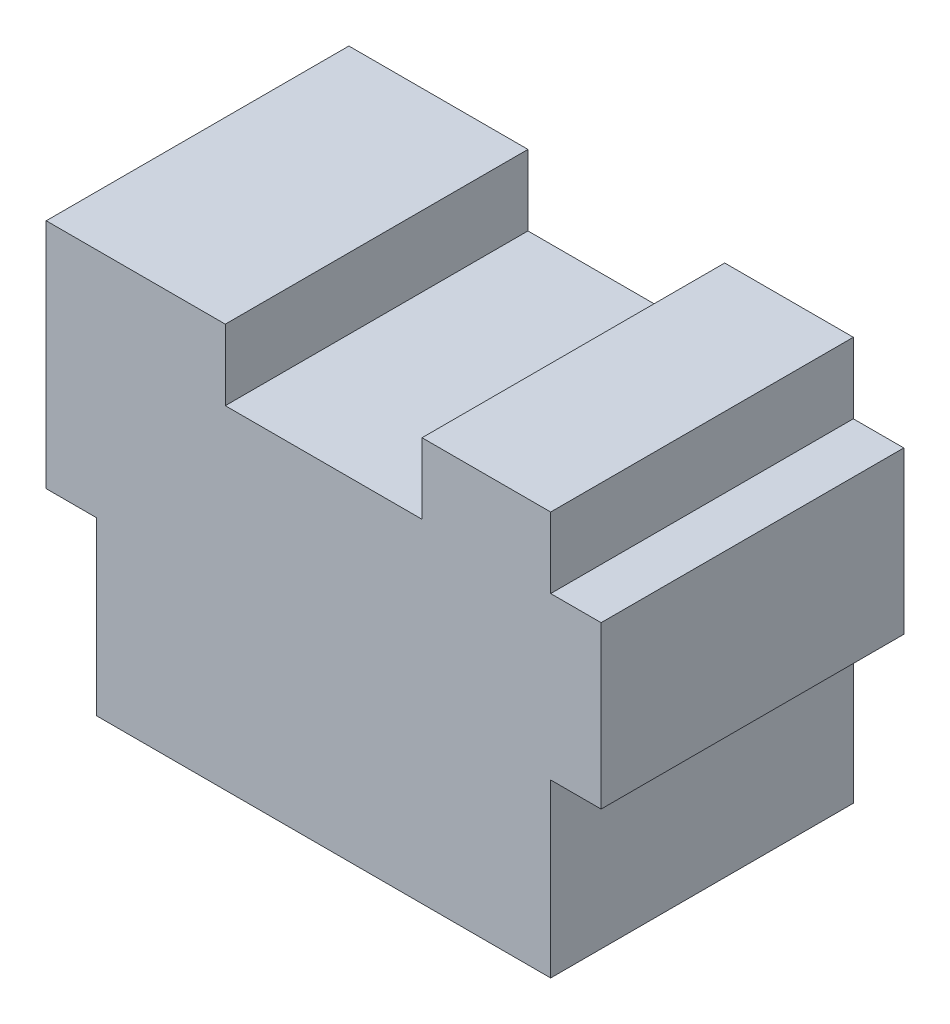
ISO-10303-21;
HEADER;
FILE_DESCRIPTION(('STEP AP214'),'2;1');
FILE_NAME('part.step','',(''),(''),'','','');
FILE_SCHEMA(('AUTOMOTIVE_DESIGN { 1 0 10303 214 1 1 1 1 }'));
ENDSEC;
DATA;
#1=APPLICATION_CONTEXT('core data for automotive mechanical design processes');
#2=APPLICATION_PROTOCOL_DEFINITION('international standard','automotive_design',2000,#1);
#3=PRODUCT_CONTEXT('',#1,'mechanical');
#4=PRODUCT('Part','Part','',(#3));
#5=PRODUCT_RELATED_PRODUCT_CATEGORY('part','',(#4));
#6=PRODUCT_DEFINITION_FORMATION('','',#4);
#7=PRODUCT_DEFINITION_CONTEXT('part definition',#1,'design');
#8=PRODUCT_DEFINITION('design','',#6,#7);
#9=PRODUCT_DEFINITION_SHAPE('','',#8);
#10=(LENGTH_UNIT() NAMED_UNIT(*) SI_UNIT(.MILLI.,.METRE.));
#11=(NAMED_UNIT(*) PLANE_ANGLE_UNIT() SI_UNIT($,.RADIAN.));
#12=(NAMED_UNIT(*) SI_UNIT($,.STERADIAN.) SOLID_ANGLE_UNIT());
#13=UNCERTAINTY_MEASURE_WITH_UNIT(LENGTH_MEASURE(1.E-05),#10,'distance_accuracy_value','');
#14=(GEOMETRIC_REPRESENTATION_CONTEXT(3) GLOBAL_UNCERTAINTY_ASSIGNED_CONTEXT((#13)) GLOBAL_UNIT_ASSIGNED_CONTEXT((#10,
#11,#12)) REPRESENTATION_CONTEXT('',''));
#15=CARTESIAN_POINT('',(0.,0.,0.));
#16=DIRECTION('',(0.,0.,1.));
#17=DIRECTION('',(1.,0.,0.));
#18=AXIS2_PLACEMENT_3D('',#15,#16,#17);
#19=CARTESIAN_POINT('',(-22.5,0.,30.));
#20=DIRECTION('',(-1.,0.,0.));
#21=DIRECTION('',(0.,0.,1.));
#22=AXIS2_PLACEMENT_3D('',#19,#20,#21);
#23=PLANE('',#22);
#24=DIRECTION('',(0.,1.,0.));
#25=VECTOR('',#24,1.);
#26=CARTESIAN_POINT('',(-22.5,0.,0.));
#27=LINE('',#26,#25);
#28=CARTESIAN_POINT('',(-22.5,-20.,0.));
#29=VERTEX_POINT('',#28);
#30=CARTESIAN_POINT('',(-22.5,-3.,0.));
#31=VERTEX_POINT('',#30);
#32=EDGE_CURVE('E177',#29,#31,#27,.T.);
#33=ORIENTED_EDGE('',*,*,#32,.F.);
#34=DIRECTION('',(0.,0.,-1.));
#35=VECTOR('',#34,1.);
#36=CARTESIAN_POINT('',(-22.5,-20.,30.));
#37=LINE('',#36,#35);
#38=CARTESIAN_POINT('',(-22.5,-20.,30.));
#39=VERTEX_POINT('',#38);
#40=EDGE_CURVE('E11',#39,#29,#37,.T.);
#41=ORIENTED_EDGE('',*,*,#40,.F.);
#42=DIRECTION('',(0.,1.,0.));
#43=VECTOR('',#42,1.);
#44=CARTESIAN_POINT('',(-22.5,0.,30.));
#45=LINE('',#44,#43);
#46=CARTESIAN_POINT('',(-22.5,-3.,30.));
#47=VERTEX_POINT('',#46);
#48=EDGE_CURVE('E214',#39,#47,#45,.T.);
#49=ORIENTED_EDGE('',*,*,#48,.T.);
#50=DIRECTION('',(0.,0.,-1.));
#51=VECTOR('',#50,1.);
#52=CARTESIAN_POINT('',(-22.5,-3.,30.));
#53=LINE('',#52,#51);
#54=EDGE_CURVE('E110',#47,#31,#53,.T.);
#55=ORIENTED_EDGE('',*,*,#54,.T.);
#56=EDGE_LOOP('',(#33,#41,#49,#55));
#57=FACE_BOUND('',#56,.T.);
#58=ADVANCED_FACE('F36',(#57),#23,.T.);
#59=CARTESIAN_POINT('',(0.,-20.,30.));
#60=DIRECTION('',(0.,1.,0.));
#61=DIRECTION('',(0.,0.,1.));
#62=AXIS2_PLACEMENT_3D('',#59,#60,#61);
#63=PLANE('',#62);
#64=DIRECTION('',(1.,0.,0.));
#65=VECTOR('',#64,1.);
#66=CARTESIAN_POINT('',(0.,-20.,0.));
#67=LINE('',#66,#65);
#68=CARTESIAN_POINT('',(-9.74999999999999,-20.,0.));
#69=VERTEX_POINT('',#68);
#70=EDGE_CURVE('E182',#29,#69,#67,.T.);
#71=ORIENTED_EDGE('',*,*,#70,.T.);
#72=DIRECTION('',(0.,0.,-1.));
#73=VECTOR('',#72,1.);
#74=CARTESIAN_POINT('',(-9.74999999999999,-20.,26.));
#75=LINE('',#74,#73);
#76=CARTESIAN_POINT('',(-9.74999999999999,-20.,26.));
#77=VERTEX_POINT('',#76);
#78=EDGE_CURVE('E181',#77,#69,#75,.T.);
#79=ORIENTED_EDGE('',*,*,#78,.F.);
#80=DIRECTION('',(1.,0.,0.));
#81=VECTOR('',#80,1.);
#82=CARTESIAN_POINT('',(-37.2636329843952,-20.,26.));
#83=LINE('',#82,#81);
#84=CARTESIAN_POINT('',(9.75,-20.,26.));
#85=VERTEX_POINT('',#84);
#86=EDGE_CURVE('E295',#77,#85,#83,.T.);
#87=ORIENTED_EDGE('',*,*,#86,.T.);
#88=DIRECTION('',(0.,0.,1.));
#89=VECTOR('',#88,1.);
#90=CARTESIAN_POINT('',(9.75,-20.,26.));
#91=LINE('',#90,#89);
#92=CARTESIAN_POINT('',(9.75,-20.,0.));
#93=VERTEX_POINT('',#92);
#94=EDGE_CURVE('E304',#93,#85,#91,.T.);
#95=ORIENTED_EDGE('',*,*,#94,.F.);
#96=CARTESIAN_POINT('',(22.5,-20.,0.));
#97=VERTEX_POINT('',#96);
#98=EDGE_CURVE('E180',#93,#97,#67,.T.);
#99=ORIENTED_EDGE('',*,*,#98,.T.);
#100=DIRECTION('',(0.,0.,-1.));
#101=VECTOR('',#100,1.);
#102=CARTESIAN_POINT('',(22.5,-20.,30.));
#103=LINE('',#102,#101);
#104=CARTESIAN_POINT('',(22.5,-20.,30.));
#105=VERTEX_POINT('',#104);
#106=EDGE_CURVE('E43',#105,#97,#103,.T.);
#107=ORIENTED_EDGE('',*,*,#106,.F.);
#108=DIRECTION('',(1.,0.,0.));
#109=VECTOR('',#108,1.);
#110=CARTESIAN_POINT('',(0.,-20.,30.));
#111=LINE('',#110,#109);
#112=EDGE_CURVE('E263',#39,#105,#111,.T.);
#113=ORIENTED_EDGE('',*,*,#112,.F.);
#114=ORIENTED_EDGE('',*,*,#40,.T.);
#115=EDGE_LOOP('',(#71,#79,#87,#95,#99,#107,#113,#114));
#116=FACE_BOUND('',#115,.T.);
#117=ADVANCED_FACE('F313',(#116),#63,.F.);
#118=CARTESIAN_POINT('',(22.5,0.,30.));
#119=DIRECTION('',(-1.,0.,0.));
#120=DIRECTION('',(0.,0.,1.));
#121=AXIS2_PLACEMENT_3D('',#118,#119,#120);
#122=PLANE('',#121);
#123=DIRECTION('',(0.,1.,0.));
#124=VECTOR('',#123,1.);
#125=CARTESIAN_POINT('',(22.5,0.,0.));
#126=LINE('',#125,#124);
#127=CARTESIAN_POINT('',(22.5,-2.99999999999999,0.));
#128=VERTEX_POINT('',#127);
#129=EDGE_CURVE('E185',#97,#128,#126,.T.);
#130=ORIENTED_EDGE('',*,*,#129,.T.);
#131=DIRECTION('',(0.,0.,-1.));
#132=VECTOR('',#131,1.);
#133=CARTESIAN_POINT('',(22.5,-2.99999999999999,30.));
#134=LINE('',#133,#132);
#135=CARTESIAN_POINT('',(22.5,-2.99999999999999,30.));
#136=VERTEX_POINT('',#135);
#137=EDGE_CURVE('E234',#136,#128,#134,.T.);
#138=ORIENTED_EDGE('',*,*,#137,.F.);
#139=DIRECTION('',(0.,1.,0.));
#140=VECTOR('',#139,1.);
#141=CARTESIAN_POINT('',(22.5,0.,30.));
#142=LINE('',#141,#140);
#143=EDGE_CURVE('E242',#105,#136,#142,.T.);
#144=ORIENTED_EDGE('',*,*,#143,.F.);
#145=ORIENTED_EDGE('',*,*,#106,.T.);
#146=EDGE_LOOP('',(#130,#138,#144,#145));
#147=FACE_BOUND('',#146,.T.);
#148=ADVANCED_FACE('F240',(#147),#122,.F.);
#149=CARTESIAN_POINT('',(0.,-3.,30.));
#150=DIRECTION('',(0.,-1.,0.));
#151=DIRECTION('',(1.,0.,0.));
#152=AXIS2_PLACEMENT_3D('',#149,#150,#151);
#153=PLANE('',#152);
#154=DIRECTION('',(-1.,0.,0.));
#155=VECTOR('',#154,1.);
#156=CARTESIAN_POINT('',(0.,-3.,0.));
#157=LINE('',#156,#155);
#158=CARTESIAN_POINT('',(27.5,-2.99999999999999,0.));
#159=VERTEX_POINT('',#158);
#160=EDGE_CURVE('E188',#159,#128,#157,.T.);
#161=ORIENTED_EDGE('',*,*,#160,.F.);
#162=DIRECTION('',(0.,0.,-1.));
#163=VECTOR('',#162,1.);
#164=CARTESIAN_POINT('',(27.5,-2.99999999999999,30.));
#165=LINE('',#164,#163);
#166=CARTESIAN_POINT('',(27.5,-2.99999999999999,30.));
#167=VERTEX_POINT('',#166);
#168=EDGE_CURVE('E232',#167,#159,#165,.T.);
#169=ORIENTED_EDGE('',*,*,#168,.F.);
#170=DIRECTION('',(-1.,0.,0.));
#171=VECTOR('',#170,1.);
#172=CARTESIAN_POINT('',(0.,-3.,30.));
#173=LINE('',#172,#171);
#174=EDGE_CURVE('E258',#167,#136,#173,.T.);
#175=ORIENTED_EDGE('',*,*,#174,.T.);
#176=ORIENTED_EDGE('',*,*,#137,.T.);
#177=EDGE_LOOP('',(#161,#169,#175,#176));
#178=FACE_BOUND('',#177,.T.);
#179=ADVANCED_FACE('F254',(#178),#153,.T.);
#180=CARTESIAN_POINT('',(27.5,0.,30.));
#181=DIRECTION('',(-1.,0.,0.));
#182=DIRECTION('',(0.,0.,1.));
#183=AXIS2_PLACEMENT_3D('',#180,#181,#182);
#184=PLANE('',#183);
#185=DIRECTION('',(0.,1.,0.));
#186=VECTOR('',#185,1.);
#187=CARTESIAN_POINT('',(27.5,0.,0.));
#188=LINE('',#187,#186);
#189=CARTESIAN_POINT('',(27.5,13.,0.));
#190=VERTEX_POINT('',#189);
#191=EDGE_CURVE('E191',#159,#190,#188,.T.);
#192=ORIENTED_EDGE('',*,*,#191,.T.);
#193=DIRECTION('',(0.,0.,-1.));
#194=VECTOR('',#193,1.);
#195=CARTESIAN_POINT('',(27.5,13.,30.));
#196=LINE('',#195,#194);
#197=CARTESIAN_POINT('',(27.5,13.,30.));
#198=VERTEX_POINT('',#197);
#199=EDGE_CURVE('E229',#198,#190,#196,.T.);
#200=ORIENTED_EDGE('',*,*,#199,.F.);
#201=DIRECTION('',(0.,1.,0.));
#202=VECTOR('',#201,1.);
#203=CARTESIAN_POINT('',(27.5,0.,30.));
#204=LINE('',#203,#202);
#205=EDGE_CURVE('E259',#167,#198,#204,.T.);
#206=ORIENTED_EDGE('',*,*,#205,.F.);
#207=ORIENTED_EDGE('',*,*,#168,.T.);
#208=EDGE_LOOP('',(#192,#200,#206,#207));
#209=FACE_BOUND('',#208,.T.);
#210=ADVANCED_FACE('F345',(#209),#184,.F.);
#211=CARTESIAN_POINT('',(0.,13.,30.));
#212=DIRECTION('',(0.,-1.,0.));
#213=DIRECTION('',(1.,0.,0.));
#214=AXIS2_PLACEMENT_3D('',#211,#212,#213);
#215=PLANE('',#214);
#216=DIRECTION('',(-1.,0.,0.));
#217=VECTOR('',#216,1.);
#218=CARTESIAN_POINT('',(0.,13.,0.));
#219=LINE('',#218,#217);
#220=CARTESIAN_POINT('',(22.5,13.,0.));
#221=VERTEX_POINT('',#220);
#222=EDGE_CURVE('E193',#190,#221,#219,.T.);
#223=ORIENTED_EDGE('',*,*,#222,.T.);
#224=DIRECTION('',(0.,0.,-1.));
#225=VECTOR('',#224,1.);
#226=CARTESIAN_POINT('',(22.5,13.,30.));
#227=LINE('',#226,#225);
#228=CARTESIAN_POINT('',(22.5,13.,30.));
#229=VERTEX_POINT('',#228);
#230=EDGE_CURVE('E227',#229,#221,#227,.T.);
#231=ORIENTED_EDGE('',*,*,#230,.F.);
#232=DIRECTION('',(-1.,0.,0.));
#233=VECTOR('',#232,1.);
#234=CARTESIAN_POINT('',(0.,13.,30.));
#235=LINE('',#234,#233);
#236=EDGE_CURVE('E261',#198,#229,#235,.T.);
#237=ORIENTED_EDGE('',*,*,#236,.F.);
#238=ORIENTED_EDGE('',*,*,#199,.T.);
#239=EDGE_LOOP('',(#223,#231,#237,#238));
#240=FACE_BOUND('',#239,.T.);
#241=ADVANCED_FACE('F348',(#240),#215,.F.);
#242=CARTESIAN_POINT('',(22.5,0.,30.));
#243=DIRECTION('',(1.,0.,0.));
#244=DIRECTION('',(0.,1.,0.));
#245=AXIS2_PLACEMENT_3D('',#242,#243,#244);
#246=PLANE('',#245);
#247=DIRECTION('',(0.,-1.,0.));
#248=VECTOR('',#247,1.);
#249=CARTESIAN_POINT('',(22.5,0.,0.));
#250=LINE('',#249,#248);
#251=CARTESIAN_POINT('',(22.5,20.,0.));
#252=VERTEX_POINT('',#251);
#253=EDGE_CURVE('E196',#252,#221,#250,.T.);
#254=ORIENTED_EDGE('',*,*,#253,.F.);
#255=DIRECTION('',(0.,0.,-1.));
#256=VECTOR('',#255,1.);
#257=CARTESIAN_POINT('',(22.5,20.,30.));
#258=LINE('',#257,#256);
#259=CARTESIAN_POINT('',(22.5,20.,30.));
#260=VERTEX_POINT('',#259);
#261=EDGE_CURVE('E225',#260,#252,#258,.T.);
#262=ORIENTED_EDGE('',*,*,#261,.F.);
#263=DIRECTION('',(0.,-1.,0.));
#264=VECTOR('',#263,1.);
#265=CARTESIAN_POINT('',(22.5,0.,30.));
#266=LINE('',#265,#264);
#267=EDGE_CURVE('E268',#260,#229,#266,.T.);
#268=ORIENTED_EDGE('',*,*,#267,.T.);
#269=ORIENTED_EDGE('',*,*,#230,.T.);
#270=EDGE_LOOP('',(#254,#262,#268,#269));
#271=FACE_BOUND('',#270,.T.);
#272=ADVANCED_FACE('F352',(#271),#246,.T.);
#273=CARTESIAN_POINT('',(0.,20.,30.));
#274=DIRECTION('',(0.,1.,0.));
#275=DIRECTION('',(0.,0.,1.));
#276=AXIS2_PLACEMENT_3D('',#273,#274,#275);
#277=PLANE('',#276);
#278=DIRECTION('',(1.,0.,0.));
#279=VECTOR('',#278,1.);
#280=CARTESIAN_POINT('',(0.,20.,0.));
#281=LINE('',#280,#279);
#282=CARTESIAN_POINT('',(9.75,20.,0.));
#283=VERTEX_POINT('',#282);
#284=EDGE_CURVE('E199',#283,#252,#281,.T.);
#285=ORIENTED_EDGE('',*,*,#284,.F.);
#286=DIRECTION('',(0.,0.,-1.));
#287=VECTOR('',#286,1.);
#288=CARTESIAN_POINT('',(9.75,20.,30.));
#289=LINE('',#288,#287);
#290=CARTESIAN_POINT('',(9.75,20.,30.));
#291=VERTEX_POINT('',#290);
#292=EDGE_CURVE('E223',#291,#283,#289,.T.);
#293=ORIENTED_EDGE('',*,*,#292,.F.);
#294=DIRECTION('',(1.,0.,0.));
#295=VECTOR('',#294,1.);
#296=CARTESIAN_POINT('',(0.,20.,30.));
#297=LINE('',#296,#295);
#298=EDGE_CURVE('E170',#291,#260,#297,.T.);
#299=ORIENTED_EDGE('',*,*,#298,.T.);
#300=ORIENTED_EDGE('',*,*,#261,.T.);
#301=EDGE_LOOP('',(#285,#293,#299,#300));
#302=FACE_BOUND('',#301,.T.);
#303=ADVANCED_FACE('F356',(#302),#277,.T.);
#304=CARTESIAN_POINT('',(9.75,0.,30.));
#305=DIRECTION('',(-1.,0.,0.));
#306=DIRECTION('',(0.,0.,1.));
#307=AXIS2_PLACEMENT_3D('',#304,#305,#306);
#308=PLANE('',#307);
#309=DIRECTION('',(0.,1.,0.));
#310=VECTOR('',#309,1.);
#311=CARTESIAN_POINT('',(9.75,0.,0.));
#312=LINE('',#311,#310);
#313=CARTESIAN_POINT('',(9.75,13.,0.));
#314=VERTEX_POINT('',#313);
#315=EDGE_CURVE('E202',#314,#283,#312,.T.);
#316=ORIENTED_EDGE('',*,*,#315,.F.);
#317=DIRECTION('',(0.,0.,-1.));
#318=VECTOR('',#317,1.);
#319=CARTESIAN_POINT('',(9.75,13.,30.));
#320=LINE('',#319,#318);
#321=CARTESIAN_POINT('',(9.75,13.,30.));
#322=VERTEX_POINT('',#321);
#323=EDGE_CURVE('E221',#322,#314,#320,.T.);
#324=ORIENTED_EDGE('',*,*,#323,.F.);
#325=DIRECTION('',(0.,1.,0.));
#326=VECTOR('',#325,1.);
#327=CARTESIAN_POINT('',(9.75,0.,30.));
#328=LINE('',#327,#326);
#329=EDGE_CURVE('E272',#322,#291,#328,.T.);
#330=ORIENTED_EDGE('',*,*,#329,.T.);
#331=ORIENTED_EDGE('',*,*,#292,.T.);
#332=EDGE_LOOP('',(#316,#324,#330,#331));
#333=FACE_BOUND('',#332,.T.);
#334=ADVANCED_FACE('F358',(#333),#308,.T.);
#335=CARTESIAN_POINT('',(0.,13.,30.));
#336=DIRECTION('',(0.,-1.,0.));
#337=DIRECTION('',(1.,0.,0.));
#338=AXIS2_PLACEMENT_3D('',#335,#336,#337);
#339=PLANE('',#338);
#340=DIRECTION('',(-1.,0.,0.));
#341=VECTOR('',#340,1.);
#342=CARTESIAN_POINT('',(0.,13.,0.));
#343=LINE('',#342,#341);
#344=CARTESIAN_POINT('',(-9.75,13.,0.));
#345=VERTEX_POINT('',#344);
#346=EDGE_CURVE('E205',#314,#345,#343,.T.);
#347=ORIENTED_EDGE('',*,*,#346,.T.);
#348=DIRECTION('',(0.,0.,-1.));
#349=VECTOR('',#348,1.);
#350=CARTESIAN_POINT('',(-9.75,13.,30.));
#351=LINE('',#350,#349);
#352=CARTESIAN_POINT('',(-9.75,13.,30.));
#353=VERTEX_POINT('',#352);
#354=EDGE_CURVE('E218',#353,#345,#351,.T.);
#355=ORIENTED_EDGE('',*,*,#354,.F.);
#356=DIRECTION('',(-1.,0.,0.));
#357=VECTOR('',#356,1.);
#358=CARTESIAN_POINT('',(0.,13.,30.));
#359=LINE('',#358,#357);
#360=EDGE_CURVE('E274',#322,#353,#359,.T.);
#361=ORIENTED_EDGE('',*,*,#360,.F.);
#362=ORIENTED_EDGE('',*,*,#323,.T.);
#363=EDGE_LOOP('',(#347,#355,#361,#362));
#364=FACE_BOUND('',#363,.T.);
#365=ADVANCED_FACE('F280',(#364),#339,.F.);
#366=CARTESIAN_POINT('',(-9.75,0.,30.));
#367=DIRECTION('',(-1.,0.,0.));
#368=DIRECTION('',(0.,0.,1.));
#369=AXIS2_PLACEMENT_3D('',#366,#367,#368);
#370=PLANE('',#369);
#371=DIRECTION('',(0.,1.,0.));
#372=VECTOR('',#371,1.);
#373=CARTESIAN_POINT('',(-9.75,0.,0.));
#374=LINE('',#373,#372);
#375=CARTESIAN_POINT('',(-9.75,20.,0.));
#376=VERTEX_POINT('',#375);
#377=EDGE_CURVE('E207',#345,#376,#374,.T.);
#378=ORIENTED_EDGE('',*,*,#377,.T.);
#379=DIRECTION('',(0.,0.,-1.));
#380=VECTOR('',#379,1.);
#381=CARTESIAN_POINT('',(-9.75,20.,30.));
#382=LINE('',#381,#380);
#383=CARTESIAN_POINT('',(-9.75,20.,30.));
#384=VERTEX_POINT('',#383);
#385=EDGE_CURVE('E161',#384,#376,#382,.T.);
#386=ORIENTED_EDGE('',*,*,#385,.F.);
#387=DIRECTION('',(0.,1.,0.));
#388=VECTOR('',#387,1.);
#389=CARTESIAN_POINT('',(-9.75,0.,30.));
#390=LINE('',#389,#388);
#391=EDGE_CURVE('E167',#353,#384,#390,.T.);
#392=ORIENTED_EDGE('',*,*,#391,.F.);
#393=ORIENTED_EDGE('',*,*,#354,.T.);
#394=EDGE_LOOP('',(#378,#386,#392,#393));
#395=FACE_BOUND('',#394,.T.);
#396=ADVANCED_FACE('F284',(#395),#370,.F.);
#397=CARTESIAN_POINT('',(-27.5,20.,0.));
#398=VERTEX_POINT('',#397);
#399=EDGE_CURVE('E156',#398,#376,#281,.T.);
#400=ORIENTED_EDGE('',*,*,#399,.F.);
#401=DIRECTION('',(0.,0.,-1.));
#402=VECTOR('',#401,1.);
#403=CARTESIAN_POINT('',(-27.5,20.,30.));
#404=LINE('',#403,#402);
#405=CARTESIAN_POINT('',(-27.5,20.,30.));
#406=VERTEX_POINT('',#405);
#407=EDGE_CURVE('E151',#406,#398,#404,.T.);
#408=ORIENTED_EDGE('',*,*,#407,.F.);
#409=EDGE_CURVE('E154',#406,#384,#297,.T.);
#410=ORIENTED_EDGE('',*,*,#409,.T.);
#411=ORIENTED_EDGE('',*,*,#385,.T.);
#412=EDGE_LOOP('',(#400,#408,#410,#411));
#413=FACE_BOUND('',#412,.T.);
#414=ADVANCED_FACE('F153',(#413),#277,.T.);
#415=CARTESIAN_POINT('',(-27.5,0.,30.));
#416=DIRECTION('',(-1.,0.,0.));
#417=DIRECTION('',(0.,0.,1.));
#418=AXIS2_PLACEMENT_3D('',#415,#416,#417);
#419=PLANE('',#418);
#420=DIRECTION('',(0.,1.,0.));
#421=VECTOR('',#420,1.);
#422=CARTESIAN_POINT('',(-27.5,0.,0.));
#423=LINE('',#422,#421);
#424=CARTESIAN_POINT('',(-27.5,-2.99999999999999,0.));
#425=VERTEX_POINT('',#424);
#426=EDGE_CURVE('E210',#425,#398,#423,.T.);
#427=ORIENTED_EDGE('',*,*,#426,.F.);
#428=DIRECTION('',(0.,0.,-1.));
#429=VECTOR('',#428,1.);
#430=CARTESIAN_POINT('',(-27.5,-2.99999999999999,30.));
#431=LINE('',#430,#429);
#432=CARTESIAN_POINT('',(-27.5,-2.99999999999999,30.));
#433=VERTEX_POINT('',#432);
#434=EDGE_CURVE('E162',#433,#425,#431,.T.);
#435=ORIENTED_EDGE('',*,*,#434,.F.);
#436=DIRECTION('',(0.,1.,0.));
#437=VECTOR('',#436,1.);
#438=CARTESIAN_POINT('',(-27.5,0.,30.));
#439=LINE('',#438,#437);
#440=EDGE_CURVE('E165',#433,#406,#439,.T.);
#441=ORIENTED_EDGE('',*,*,#440,.T.);
#442=ORIENTED_EDGE('',*,*,#407,.T.);
#443=EDGE_LOOP('',(#427,#435,#441,#442));
#444=FACE_BOUND('',#443,.T.);
#445=ADVANCED_FACE('F171',(#444),#419,.T.);
#446=CARTESIAN_POINT('',(0.,-3.00000000000004,30.));
#447=DIRECTION('',(0.,1.,0.));
#448=DIRECTION('',(-1.,0.,0.));
#449=AXIS2_PLACEMENT_3D('',#446,#447,#448);
#450=PLANE('',#449);
#451=DIRECTION('',(1.,0.,0.));
#452=VECTOR('',#451,1.);
#453=CARTESIAN_POINT('',(0.,-3.00000000000004,0.));
#454=LINE('',#453,#452);
#455=EDGE_CURVE('E212',#425,#31,#454,.T.);
#456=ORIENTED_EDGE('',*,*,#455,.T.);
#457=ORIENTED_EDGE('',*,*,#54,.F.);
#458=DIRECTION('',(1.,0.,0.));
#459=VECTOR('',#458,1.);
#460=CARTESIAN_POINT('',(0.,-3.00000000000004,30.));
#461=LINE('',#460,#459);
#462=EDGE_CURVE('E59',#433,#47,#461,.T.);
#463=ORIENTED_EDGE('',*,*,#462,.F.);
#464=ORIENTED_EDGE('',*,*,#434,.T.);
#465=EDGE_LOOP('',(#456,#457,#463,#464));
#466=FACE_BOUND('',#465,.T.);
#467=ADVANCED_FACE('F288',(#466),#450,.F.);
#468=CARTESIAN_POINT('',(0.,0.,30.));
#469=DIRECTION('',(0.,0.,1.));
#470=DIRECTION('',(1.,0.,0.));
#471=AXIS2_PLACEMENT_3D('',#468,#469,#470);
#472=PLANE('',#471);
#473=ORIENTED_EDGE('',*,*,#48,.F.);
#474=ORIENTED_EDGE('',*,*,#112,.T.);
#475=ORIENTED_EDGE('',*,*,#143,.T.);
#476=ORIENTED_EDGE('',*,*,#174,.F.);
#477=ORIENTED_EDGE('',*,*,#205,.T.);
#478=ORIENTED_EDGE('',*,*,#236,.T.);
#479=ORIENTED_EDGE('',*,*,#267,.F.);
#480=ORIENTED_EDGE('',*,*,#298,.F.);
#481=ORIENTED_EDGE('',*,*,#329,.F.);
#482=ORIENTED_EDGE('',*,*,#360,.T.);
#483=ORIENTED_EDGE('',*,*,#391,.T.);
#484=ORIENTED_EDGE('',*,*,#409,.F.);
#485=ORIENTED_EDGE('',*,*,#440,.F.);
#486=ORIENTED_EDGE('',*,*,#462,.T.);
#487=EDGE_LOOP('',(#473,#474,#475,#476,#477,#478,#479,#480,#481,#482,#483,#484,#485,#486));
#488=FACE_BOUND('',#487,.T.);
#489=ADVANCED_FACE('F164',(#488),#472,.T.);
#490=CARTESIAN_POINT('',(0.,0.,0.));
#491=DIRECTION('',(0.,0.,1.));
#492=DIRECTION('',(1.,0.,0.));
#493=AXIS2_PLACEMENT_3D('',#490,#491,#492);
#494=PLANE('',#493);
#495=DIRECTION('',(1.,0.,0.));
#496=VECTOR('',#495,1.);
#497=CARTESIAN_POINT('',(-37.2636329843952,-11.,0.));
#498=LINE('',#497,#496);
#499=CARTESIAN_POINT('',(-9.74999999999999,-11.,0.));
#500=VERTEX_POINT('',#499);
#501=CARTESIAN_POINT('',(9.75,-11.,0.));
#502=VERTEX_POINT('',#501);
#503=EDGE_CURVE('E291',#500,#502,#498,.T.);
#504=ORIENTED_EDGE('',*,*,#503,.F.);
#505=DIRECTION('',(0.,1.,0.));
#506=VECTOR('',#505,1.);
#507=CARTESIAN_POINT('',(-9.74999999999999,-20.,0.));
#508=LINE('',#507,#506);
#509=EDGE_CURVE('E294',#69,#500,#508,.T.);
#510=ORIENTED_EDGE('',*,*,#509,.F.);
#511=ORIENTED_EDGE('',*,*,#70,.F.);
#512=ORIENTED_EDGE('',*,*,#32,.T.);
#513=ORIENTED_EDGE('',*,*,#455,.F.);
#514=ORIENTED_EDGE('',*,*,#426,.T.);
#515=ORIENTED_EDGE('',*,*,#399,.T.);
#516=ORIENTED_EDGE('',*,*,#377,.F.);
#517=ORIENTED_EDGE('',*,*,#346,.F.);
#518=ORIENTED_EDGE('',*,*,#315,.T.);
#519=ORIENTED_EDGE('',*,*,#284,.T.);
#520=ORIENTED_EDGE('',*,*,#253,.T.);
#521=ORIENTED_EDGE('',*,*,#222,.F.);
#522=ORIENTED_EDGE('',*,*,#191,.F.);
#523=ORIENTED_EDGE('',*,*,#160,.T.);
#524=ORIENTED_EDGE('',*,*,#129,.F.);
#525=ORIENTED_EDGE('',*,*,#98,.F.);
#526=DIRECTION('',(0.,-1.,0.));
#527=VECTOR('',#526,1.);
#528=CARTESIAN_POINT('',(9.75,-20.,0.));
#529=LINE('',#528,#527);
#530=EDGE_CURVE('E306',#502,#93,#529,.T.);
#531=ORIENTED_EDGE('',*,*,#530,.F.);
#532=EDGE_LOOP('',(#504,#510,#511,#512,#513,#514,#515,#516,#517,#518,#519,#520,#521,#522,#523,
#524,#525,#531));
#533=FACE_BOUND('',#532,.T.);
#534=ADVANCED_FACE('F247',(#533),#494,.F.);
#535=CARTESIAN_POINT('',(-9.75,0.,30.));
#536=DIRECTION('',(-1.,0.,0.));
#537=DIRECTION('',(0.,0.,1.));
#538=AXIS2_PLACEMENT_3D('',#535,#536,#537);
#539=PLANE('',#538);
#540=ORIENTED_EDGE('',*,*,#78,.T.);
#541=ORIENTED_EDGE('',*,*,#509,.T.);
#542=DIRECTION('',(0.,-0.327110563883166,0.944986073440258));
#543=VECTOR('',#542,1.);
#544=CARTESIAN_POINT('',(-9.74999999999999,-11.,0.));
#545=LINE('',#544,#543);
#546=EDGE_CURVE('E293',#500,#77,#545,.T.);
#547=ORIENTED_EDGE('',*,*,#546,.T.);
#548=EDGE_LOOP('',(#540,#541,#547));
#549=FACE_BOUND('',#548,.T.);
#550=ADVANCED_FACE('F322',(#549),#539,.F.);
#551=CARTESIAN_POINT('',(-37.2636329843952,-11.,0.));
#552=DIRECTION('',(0.,0.944986073440258,0.327110563883166));
#553=DIRECTION('',(0.,-0.327110563883166,0.944986073440258));
#554=AXIS2_PLACEMENT_3D('',#551,#552,#553);
#555=PLANE('',#554);
#556=ORIENTED_EDGE('',*,*,#503,.T.);
#557=DIRECTION('',(0.,0.327110563883166,-0.944986073440258));
#558=VECTOR('',#557,1.);
#559=CARTESIAN_POINT('',(9.75,-11.,0.));
#560=LINE('',#559,#558);
#561=EDGE_CURVE('E50',#85,#502,#560,.T.);
#562=ORIENTED_EDGE('',*,*,#561,.F.);
#563=ORIENTED_EDGE('',*,*,#86,.F.);
#564=ORIENTED_EDGE('',*,*,#546,.F.);
#565=EDGE_LOOP('',(#556,#562,#563,#564));
#566=FACE_BOUND('',#565,.T.);
#567=ADVANCED_FACE('F319',(#566),#555,.F.);
#568=CARTESIAN_POINT('',(9.75,0.,30.));
#569=DIRECTION('',(-1.,0.,0.));
#570=DIRECTION('',(0.,0.,1.));
#571=AXIS2_PLACEMENT_3D('',#568,#569,#570);
#572=PLANE('',#571);
#573=ORIENTED_EDGE('',*,*,#530,.T.);
#574=ORIENTED_EDGE('',*,*,#94,.T.);
#575=ORIENTED_EDGE('',*,*,#561,.T.);
#576=EDGE_LOOP('',(#573,#574,#575));
#577=FACE_BOUND('',#576,.T.);
#578=ADVANCED_FACE('F309',(#577),#572,.T.);
#579=CLOSED_SHELL('',(#58,#117,#148,#179,#210,#241,#272,#303,#334,#365,#396,#414,#445,#467,#489,
#534,#550,#567,#578));
#580=MANIFOLD_SOLID_BREP('B2',#579);
#581=ADVANCED_BREP_SHAPE_REPRESENTATION('',(#18,#580),#14);
#582=SHAPE_DEFINITION_REPRESENTATION(#9,#581);
ENDSEC;
END-ISO-10303-21;
